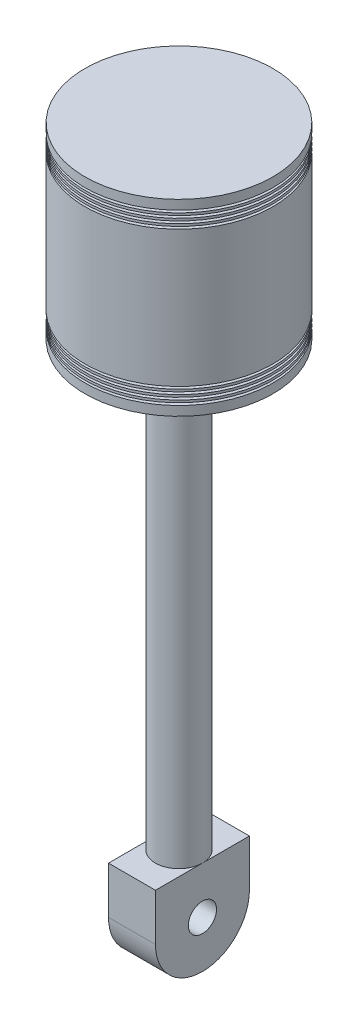
ISO-10303-21;
HEADER;
FILE_DESCRIPTION(('STEP AP214'),'2;1');
FILE_NAME('part.step','',(''),(''),'','','');
FILE_SCHEMA(('AUTOMOTIVE_DESIGN { 1 0 10303 214 1 1 1 1 }'));
ENDSEC;
DATA;
#1=APPLICATION_CONTEXT('core data for automotive mechanical design processes');
#2=APPLICATION_PROTOCOL_DEFINITION('international standard','automotive_design',2000,#1);
#3=PRODUCT_CONTEXT('',#1,'mechanical');
#4=PRODUCT('Part','Part','',(#3));
#5=PRODUCT_RELATED_PRODUCT_CATEGORY('part','',(#4));
#6=PRODUCT_DEFINITION_FORMATION('','',#4);
#7=PRODUCT_DEFINITION_CONTEXT('part definition',#1,'design');
#8=PRODUCT_DEFINITION('design','',#6,#7);
#9=PRODUCT_DEFINITION_SHAPE('','',#8);
#10=(LENGTH_UNIT() NAMED_UNIT(*) SI_UNIT(.MILLI.,.METRE.));
#11=(NAMED_UNIT(*) PLANE_ANGLE_UNIT() SI_UNIT($,.RADIAN.));
#12=(NAMED_UNIT(*) SI_UNIT($,.STERADIAN.) SOLID_ANGLE_UNIT());
#13=UNCERTAINTY_MEASURE_WITH_UNIT(LENGTH_MEASURE(1.E-05),#10,'distance_accuracy_value','');
#14=(GEOMETRIC_REPRESENTATION_CONTEXT(3) GLOBAL_UNCERTAINTY_ASSIGNED_CONTEXT((#13)) GLOBAL_UNIT_ASSIGNED_CONTEXT((#10,
#11,#12)) REPRESENTATION_CONTEXT('',''));
#15=CARTESIAN_POINT('',(0.,0.,0.));
#16=DIRECTION('',(0.,0.,1.));
#17=DIRECTION('',(1.,0.,0.));
#18=AXIS2_PLACEMENT_3D('',#15,#16,#17);
#19=CARTESIAN_POINT('',(-10.12,20.,-10.12));
#20=DIRECTION('',(0.,1.,0.));
#21=DIRECTION('',(0.,0.,1.));
#22=AXIS2_PLACEMENT_3D('',#19,#20,#21);
#23=PLANE('',#22);
#24=CARTESIAN_POINT('',(0.,20.,0.));
#25=DIRECTION('',(0.,-1.,0.));
#26=DIRECTION('',(1.,0.,0.));
#27=AXIS2_PLACEMENT_3D('',#24,#25,#26);
#28=CIRCLE('',#27,10.);
#29=CARTESIAN_POINT('',(10.,20.,0.));
#30=VERTEX_POINT('',#29);
#31=EDGE_CURVE('E21',#30,#30,#28,.F.);
#32=ORIENTED_EDGE('',*,*,#31,.T.);
#33=EDGE_LOOP('',(#32));
#34=FACE_BOUND('',#33,.T.);
#35=ADVANCED_FACE('F17',(#34),#23,.T.);
#36=CARTESIAN_POINT('',(0.,20.,0.));
#37=DIRECTION('',(0.,-1.,0.));
#38=DIRECTION('',(1.,0.,0.));
#39=AXIS2_PLACEMENT_3D('',#36,#37,#38);
#40=CYLINDRICAL_SURFACE('',#39,10.);
#41=ORIENTED_EDGE('',*,*,#31,.F.);
#42=EDGE_LOOP('',(#41));
#43=FACE_BOUND('',#42,.T.);
#44=CARTESIAN_POINT('',(0.,19.,0.));
#45=DIRECTION('',(0.,-1.,0.));
#46=DIRECTION('',(1.,0.,0.));
#47=AXIS2_PLACEMENT_3D('',#44,#45,#46);
#48=CIRCLE('',#47,10.);
#49=CARTESIAN_POINT('',(10.,19.,0.));
#50=VERTEX_POINT('',#49);
#51=EDGE_CURVE('E234',#50,#50,#48,.T.);
#52=ORIENTED_EDGE('',*,*,#51,.F.);
#53=EDGE_LOOP('',(#52));
#54=FACE_BOUND('',#53,.T.);
#55=ADVANCED_FACE('F242',(#43,#54),#40,.T.);
#56=CARTESIAN_POINT('',(-10.12,19.,10.12));
#57=DIRECTION('',(0.,-1.,0.));
#58=DIRECTION('',(0.,0.,-1.));
#59=AXIS2_PLACEMENT_3D('',#56,#57,#58);
#60=PLANE('',#59);
#61=CARTESIAN_POINT('',(0.,19.,0.));
#62=DIRECTION('',(0.,-1.,0.));
#63=DIRECTION('',(0.,0.,-1.));
#64=AXIS2_PLACEMENT_3D('',#61,#62,#63);
#65=CIRCLE('',#64,9.5);
#66=CARTESIAN_POINT('',(0.,19.,-9.5));
#67=VERTEX_POINT('',#66);
#68=EDGE_CURVE('E232',#67,#67,#65,.F.);
#69=ORIENTED_EDGE('',*,*,#68,.T.);
#70=EDGE_LOOP('',(#69));
#71=FACE_BOUND('',#70,.T.);
#72=ORIENTED_EDGE('',*,*,#51,.T.);
#73=EDGE_LOOP('',(#72));
#74=FACE_BOUND('',#73,.T.);
#75=ADVANCED_FACE('F245',(#71,#74),#60,.T.);
#76=CARTESIAN_POINT('',(0.,19.,0.));
#77=DIRECTION('',(0.,-1.,0.));
#78=DIRECTION('',(0.,0.,-1.));
#79=AXIS2_PLACEMENT_3D('',#76,#77,#78);
#80=CYLINDRICAL_SURFACE('',#79,9.5);
#81=ORIENTED_EDGE('',*,*,#68,.F.);
#82=EDGE_LOOP('',(#81));
#83=FACE_BOUND('',#82,.T.);
#84=CARTESIAN_POINT('',(0.,18.75,0.));
#85=DIRECTION('',(0.,-1.,0.));
#86=DIRECTION('',(0.,0.,-1.));
#87=AXIS2_PLACEMENT_3D('',#84,#85,#86);
#88=CIRCLE('',#87,9.5);
#89=CARTESIAN_POINT('',(0.,18.75,-9.5));
#90=VERTEX_POINT('',#89);
#91=EDGE_CURVE('E229',#90,#90,#88,.T.);
#92=ORIENTED_EDGE('',*,*,#91,.F.);
#93=EDGE_LOOP('',(#92));
#94=FACE_BOUND('',#93,.T.);
#95=ADVANCED_FACE('F252',(#83,#94),#80,.T.);
#96=CARTESIAN_POINT('',(-10.12,18.75,-10.12));
#97=DIRECTION('',(0.,1.,0.));
#98=DIRECTION('',(0.,0.,1.));
#99=AXIS2_PLACEMENT_3D('',#96,#97,#98);
#100=PLANE('',#99);
#101=ORIENTED_EDGE('',*,*,#91,.T.);
#102=EDGE_LOOP('',(#101));
#103=FACE_BOUND('',#102,.T.);
#104=CARTESIAN_POINT('',(0.,18.75,0.));
#105=DIRECTION('',(0.,-1.,0.));
#106=DIRECTION('',(0.,0.,-1.));
#107=AXIS2_PLACEMENT_3D('',#104,#105,#106);
#108=CIRCLE('',#107,10.);
#109=CARTESIAN_POINT('',(0.,18.75,-10.));
#110=VERTEX_POINT('',#109);
#111=EDGE_CURVE('E226',#110,#110,#108,.F.);
#112=ORIENTED_EDGE('',*,*,#111,.T.);
#113=EDGE_LOOP('',(#112));
#114=FACE_BOUND('',#113,.T.);
#115=ADVANCED_FACE('F349',(#103,#114),#100,.T.);
#116=CARTESIAN_POINT('',(0.,18.75,0.));
#117=DIRECTION('',(0.,-1.,0.));
#118=DIRECTION('',(0.,0.,-1.));
#119=AXIS2_PLACEMENT_3D('',#116,#117,#118);
#120=CYLINDRICAL_SURFACE('',#119,10.);
#121=ORIENTED_EDGE('',*,*,#111,.F.);
#122=EDGE_LOOP('',(#121));
#123=FACE_BOUND('',#122,.T.);
#124=CARTESIAN_POINT('',(0.,18.5,0.));
#125=DIRECTION('',(0.,-1.,0.));
#126=DIRECTION('',(0.,0.,-1.));
#127=AXIS2_PLACEMENT_3D('',#124,#125,#126);
#128=CIRCLE('',#127,10.);
#129=CARTESIAN_POINT('',(0.,18.5,-10.));
#130=VERTEX_POINT('',#129);
#131=EDGE_CURVE('E223',#130,#130,#128,.T.);
#132=ORIENTED_EDGE('',*,*,#131,.F.);
#133=EDGE_LOOP('',(#132));
#134=FACE_BOUND('',#133,.T.);
#135=ADVANCED_FACE('F347',(#123,#134),#120,.T.);
#136=CARTESIAN_POINT('',(-10.12,18.5,10.12));
#137=DIRECTION('',(0.,-1.,0.));
#138=DIRECTION('',(0.,0.,-1.));
#139=AXIS2_PLACEMENT_3D('',#136,#137,#138);
#140=PLANE('',#139);
#141=CARTESIAN_POINT('',(0.,18.5,0.));
#142=DIRECTION('',(0.,-1.,0.));
#143=DIRECTION('',(1.,0.,0.));
#144=AXIS2_PLACEMENT_3D('',#141,#142,#143);
#145=CIRCLE('',#144,9.5);
#146=CARTESIAN_POINT('',(9.5,18.5,0.));
#147=VERTEX_POINT('',#146);
#148=EDGE_CURVE('E220',#147,#147,#145,.F.);
#149=ORIENTED_EDGE('',*,*,#148,.T.);
#150=EDGE_LOOP('',(#149));
#151=FACE_BOUND('',#150,.T.);
#152=ORIENTED_EDGE('',*,*,#131,.T.);
#153=EDGE_LOOP('',(#152));
#154=FACE_BOUND('',#153,.T.);
#155=ADVANCED_FACE('F345',(#151,#154),#140,.T.);
#156=CARTESIAN_POINT('',(0.,18.5,0.));
#157=DIRECTION('',(0.,-1.,0.));
#158=DIRECTION('',(1.,0.,0.));
#159=AXIS2_PLACEMENT_3D('',#156,#157,#158);
#160=CYLINDRICAL_SURFACE('',#159,9.5);
#161=ORIENTED_EDGE('',*,*,#148,.F.);
#162=EDGE_LOOP('',(#161));
#163=FACE_BOUND('',#162,.T.);
#164=CARTESIAN_POINT('',(0.,18.25,0.));
#165=DIRECTION('',(0.,-1.,0.));
#166=DIRECTION('',(1.,0.,0.));
#167=AXIS2_PLACEMENT_3D('',#164,#165,#166);
#168=CIRCLE('',#167,9.5);
#169=CARTESIAN_POINT('',(9.5,18.25,0.));
#170=VERTEX_POINT('',#169);
#171=EDGE_CURVE('E217',#170,#170,#168,.T.);
#172=ORIENTED_EDGE('',*,*,#171,.F.);
#173=EDGE_LOOP('',(#172));
#174=FACE_BOUND('',#173,.T.);
#175=ADVANCED_FACE('F342',(#163,#174),#160,.T.);
#176=CARTESIAN_POINT('',(-10.12,18.25,-10.12));
#177=DIRECTION('',(0.,1.,0.));
#178=DIRECTION('',(0.,0.,1.));
#179=AXIS2_PLACEMENT_3D('',#176,#177,#178);
#180=PLANE('',#179);
#181=ORIENTED_EDGE('',*,*,#171,.T.);
#182=EDGE_LOOP('',(#181));
#183=FACE_BOUND('',#182,.T.);
#184=CARTESIAN_POINT('',(0.,18.25,0.));
#185=DIRECTION('',(0.,-1.,0.));
#186=DIRECTION('',(0.,0.,-1.));
#187=AXIS2_PLACEMENT_3D('',#184,#185,#186);
#188=CIRCLE('',#187,10.);
#189=CARTESIAN_POINT('',(0.,18.25,-10.));
#190=VERTEX_POINT('',#189);
#191=EDGE_CURVE('E214',#190,#190,#188,.F.);
#192=ORIENTED_EDGE('',*,*,#191,.T.);
#193=EDGE_LOOP('',(#192));
#194=FACE_BOUND('',#193,.T.);
#195=ADVANCED_FACE('F340',(#183,#194),#180,.T.);
#196=CARTESIAN_POINT('',(0.,18.25,0.));
#197=DIRECTION('',(0.,-1.,0.));
#198=DIRECTION('',(0.,0.,-1.));
#199=AXIS2_PLACEMENT_3D('',#196,#197,#198);
#200=CYLINDRICAL_SURFACE('',#199,10.);
#201=ORIENTED_EDGE('',*,*,#191,.F.);
#202=EDGE_LOOP('',(#201));
#203=FACE_BOUND('',#202,.T.);
#204=CARTESIAN_POINT('',(0.,18.,0.));
#205=DIRECTION('',(0.,-1.,0.));
#206=DIRECTION('',(0.,0.,-1.));
#207=AXIS2_PLACEMENT_3D('',#204,#205,#206);
#208=CIRCLE('',#207,10.);
#209=CARTESIAN_POINT('',(0.,18.,-10.));
#210=VERTEX_POINT('',#209);
#211=EDGE_CURVE('E211',#210,#210,#208,.T.);
#212=ORIENTED_EDGE('',*,*,#211,.F.);
#213=EDGE_LOOP('',(#212));
#214=FACE_BOUND('',#213,.T.);
#215=ADVANCED_FACE('F337',(#203,#214),#200,.T.);
#216=CARTESIAN_POINT('',(-10.12,18.,10.12));
#217=DIRECTION('',(0.,-1.,0.));
#218=DIRECTION('',(0.,0.,-1.));
#219=AXIS2_PLACEMENT_3D('',#216,#217,#218);
#220=PLANE('',#219);
#221=CARTESIAN_POINT('',(0.,18.,0.));
#222=DIRECTION('',(0.,-1.,0.));
#223=DIRECTION('',(0.,0.,-1.));
#224=AXIS2_PLACEMENT_3D('',#221,#222,#223);
#225=CIRCLE('',#224,9.5);
#226=CARTESIAN_POINT('',(0.,18.,-9.5));
#227=VERTEX_POINT('',#226);
#228=EDGE_CURVE('E208',#227,#227,#225,.F.);
#229=ORIENTED_EDGE('',*,*,#228,.T.);
#230=EDGE_LOOP('',(#229));
#231=FACE_BOUND('',#230,.T.);
#232=ORIENTED_EDGE('',*,*,#211,.T.);
#233=EDGE_LOOP('',(#232));
#234=FACE_BOUND('',#233,.T.);
#235=ADVANCED_FACE('F335',(#231,#234),#220,.T.);
#236=CARTESIAN_POINT('',(0.,18.,0.));
#237=DIRECTION('',(0.,-1.,0.));
#238=DIRECTION('',(0.,0.,-1.));
#239=AXIS2_PLACEMENT_3D('',#236,#237,#238);
#240=CYLINDRICAL_SURFACE('',#239,9.5);
#241=ORIENTED_EDGE('',*,*,#228,.F.);
#242=EDGE_LOOP('',(#241));
#243=FACE_BOUND('',#242,.T.);
#244=CARTESIAN_POINT('',(0.,17.75,0.));
#245=DIRECTION('',(0.,-1.,0.));
#246=DIRECTION('',(0.,0.,-1.));
#247=AXIS2_PLACEMENT_3D('',#244,#245,#246);
#248=CIRCLE('',#247,9.5);
#249=CARTESIAN_POINT('',(0.,17.75,-9.5));
#250=VERTEX_POINT('',#249);
#251=EDGE_CURVE('E205',#250,#250,#248,.T.);
#252=ORIENTED_EDGE('',*,*,#251,.F.);
#253=EDGE_LOOP('',(#252));
#254=FACE_BOUND('',#253,.T.);
#255=ADVANCED_FACE('F332',(#243,#254),#240,.T.);
#256=CARTESIAN_POINT('',(-10.12,17.75,-10.12));
#257=DIRECTION('',(0.,1.,0.));
#258=DIRECTION('',(0.,0.,1.));
#259=AXIS2_PLACEMENT_3D('',#256,#257,#258);
#260=PLANE('',#259);
#261=ORIENTED_EDGE('',*,*,#251,.T.);
#262=EDGE_LOOP('',(#261));
#263=FACE_BOUND('',#262,.T.);
#264=CARTESIAN_POINT('',(0.,17.75,0.));
#265=DIRECTION('',(0.,-1.,0.));
#266=DIRECTION('',(0.,0.,-1.));
#267=AXIS2_PLACEMENT_3D('',#264,#265,#266);
#268=CIRCLE('',#267,10.);
#269=CARTESIAN_POINT('',(0.,17.75,-10.));
#270=VERTEX_POINT('',#269);
#271=EDGE_CURVE('E202',#270,#270,#268,.F.);
#272=ORIENTED_EDGE('',*,*,#271,.T.);
#273=EDGE_LOOP('',(#272));
#274=FACE_BOUND('',#273,.T.);
#275=ADVANCED_FACE('F330',(#263,#274),#260,.T.);
#276=CARTESIAN_POINT('',(0.,17.75,0.));
#277=DIRECTION('',(0.,-1.,0.));
#278=DIRECTION('',(0.,0.,-1.));
#279=AXIS2_PLACEMENT_3D('',#276,#277,#278);
#280=CYLINDRICAL_SURFACE('',#279,10.);
#281=ORIENTED_EDGE('',*,*,#271,.F.);
#282=EDGE_LOOP('',(#281));
#283=FACE_BOUND('',#282,.T.);
#284=CARTESIAN_POINT('',(0.,17.5,0.));
#285=DIRECTION('',(0.,-1.,0.));
#286=DIRECTION('',(0.,0.,-1.));
#287=AXIS2_PLACEMENT_3D('',#284,#285,#286);
#288=CIRCLE('',#287,10.);
#289=CARTESIAN_POINT('',(0.,17.5,-10.));
#290=VERTEX_POINT('',#289);
#291=EDGE_CURVE('E199',#290,#290,#288,.T.);
#292=ORIENTED_EDGE('',*,*,#291,.F.);
#293=EDGE_LOOP('',(#292));
#294=FACE_BOUND('',#293,.T.);
#295=ADVANCED_FACE('F327',(#283,#294),#280,.T.);
#296=CARTESIAN_POINT('',(-10.12,17.5,10.12));
#297=DIRECTION('',(0.,-1.,0.));
#298=DIRECTION('',(0.,0.,-1.));
#299=AXIS2_PLACEMENT_3D('',#296,#297,#298);
#300=PLANE('',#299);
#301=CARTESIAN_POINT('',(0.,17.5,0.));
#302=DIRECTION('',(0.,-1.,0.));
#303=DIRECTION('',(0.,0.,-1.));
#304=AXIS2_PLACEMENT_3D('',#301,#302,#303);
#305=CIRCLE('',#304,9.5);
#306=CARTESIAN_POINT('',(0.,17.5,-9.5));
#307=VERTEX_POINT('',#306);
#308=EDGE_CURVE('E196',#307,#307,#305,.F.);
#309=ORIENTED_EDGE('',*,*,#308,.T.);
#310=EDGE_LOOP('',(#309));
#311=FACE_BOUND('',#310,.T.);
#312=ORIENTED_EDGE('',*,*,#291,.T.);
#313=EDGE_LOOP('',(#312));
#314=FACE_BOUND('',#313,.T.);
#315=ADVANCED_FACE('F325',(#311,#314),#300,.T.);
#316=CARTESIAN_POINT('',(0.,17.5,0.));
#317=DIRECTION('',(0.,-1.,0.));
#318=DIRECTION('',(0.,0.,-1.));
#319=AXIS2_PLACEMENT_3D('',#316,#317,#318);
#320=CYLINDRICAL_SURFACE('',#319,9.5);
#321=ORIENTED_EDGE('',*,*,#308,.F.);
#322=EDGE_LOOP('',(#321));
#323=FACE_BOUND('',#322,.T.);
#324=CARTESIAN_POINT('',(0.,17.25,0.));
#325=DIRECTION('',(0.,-1.,0.));
#326=DIRECTION('',(0.,0.,-1.));
#327=AXIS2_PLACEMENT_3D('',#324,#325,#326);
#328=CIRCLE('',#327,9.5);
#329=CARTESIAN_POINT('',(0.,17.25,-9.5));
#330=VERTEX_POINT('',#329);
#331=EDGE_CURVE('E193',#330,#330,#328,.T.);
#332=ORIENTED_EDGE('',*,*,#331,.F.);
#333=EDGE_LOOP('',(#332));
#334=FACE_BOUND('',#333,.T.);
#335=ADVANCED_FACE('F322',(#323,#334),#320,.T.);
#336=CARTESIAN_POINT('',(-10.12,17.25,-10.12));
#337=DIRECTION('',(0.,1.,0.));
#338=DIRECTION('',(0.,0.,1.));
#339=AXIS2_PLACEMENT_3D('',#336,#337,#338);
#340=PLANE('',#339);
#341=ORIENTED_EDGE('',*,*,#331,.T.);
#342=EDGE_LOOP('',(#341));
#343=FACE_BOUND('',#342,.T.);
#344=CARTESIAN_POINT('',(0.,17.25,0.));
#345=DIRECTION('',(0.,-1.,0.));
#346=DIRECTION('',(0.,0.,-1.));
#347=AXIS2_PLACEMENT_3D('',#344,#345,#346);
#348=CIRCLE('',#347,10.);
#349=CARTESIAN_POINT('',(0.,17.25,-10.));
#350=VERTEX_POINT('',#349);
#351=EDGE_CURVE('E190',#350,#350,#348,.F.);
#352=ORIENTED_EDGE('',*,*,#351,.T.);
#353=EDGE_LOOP('',(#352));
#354=FACE_BOUND('',#353,.T.);
#355=ADVANCED_FACE('F320',(#343,#354),#340,.T.);
#356=CARTESIAN_POINT('',(0.,17.25,0.));
#357=DIRECTION('',(0.,-1.,0.));
#358=DIRECTION('',(0.,0.,-1.));
#359=AXIS2_PLACEMENT_3D('',#356,#357,#358);
#360=CYLINDRICAL_SURFACE('',#359,10.);
#361=ORIENTED_EDGE('',*,*,#351,.F.);
#362=EDGE_LOOP('',(#361));
#363=FACE_BOUND('',#362,.T.);
#364=CARTESIAN_POINT('',(0.,2.75,0.));
#365=DIRECTION('',(0.,-1.,0.));
#366=DIRECTION('',(0.,0.,-1.));
#367=AXIS2_PLACEMENT_3D('',#364,#365,#366);
#368=CIRCLE('',#367,10.);
#369=CARTESIAN_POINT('',(0.,2.75,-10.));
#370=VERTEX_POINT('',#369);
#371=EDGE_CURVE('E187',#370,#370,#368,.T.);
#372=ORIENTED_EDGE('',*,*,#371,.F.);
#373=EDGE_LOOP('',(#372));
#374=FACE_BOUND('',#373,.T.);
#375=ADVANCED_FACE('F317',(#363,#374),#360,.T.);
#376=CARTESIAN_POINT('',(-10.12,2.75,10.12));
#377=DIRECTION('',(0.,-1.,0.));
#378=DIRECTION('',(0.,0.,-1.));
#379=AXIS2_PLACEMENT_3D('',#376,#377,#378);
#380=PLANE('',#379);
#381=CARTESIAN_POINT('',(0.,2.75,0.));
#382=DIRECTION('',(0.,-1.,0.));
#383=DIRECTION('',(0.,0.,-1.));
#384=AXIS2_PLACEMENT_3D('',#381,#382,#383);
#385=CIRCLE('',#384,9.5);
#386=CARTESIAN_POINT('',(0.,2.75,-9.5));
#387=VERTEX_POINT('',#386);
#388=EDGE_CURVE('E184',#387,#387,#385,.F.);
#389=ORIENTED_EDGE('',*,*,#388,.T.);
#390=EDGE_LOOP('',(#389));
#391=FACE_BOUND('',#390,.T.);
#392=ORIENTED_EDGE('',*,*,#371,.T.);
#393=EDGE_LOOP('',(#392));
#394=FACE_BOUND('',#393,.T.);
#395=ADVANCED_FACE('F315',(#391,#394),#380,.T.);
#396=CARTESIAN_POINT('',(0.,2.75,0.));
#397=DIRECTION('',(0.,-1.,0.));
#398=DIRECTION('',(0.,0.,-1.));
#399=AXIS2_PLACEMENT_3D('',#396,#397,#398);
#400=CYLINDRICAL_SURFACE('',#399,9.5);
#401=ORIENTED_EDGE('',*,*,#388,.F.);
#402=EDGE_LOOP('',(#401));
#403=FACE_BOUND('',#402,.T.);
#404=CARTESIAN_POINT('',(0.,2.5,0.));
#405=DIRECTION('',(0.,-1.,0.));
#406=DIRECTION('',(0.,0.,-1.));
#407=AXIS2_PLACEMENT_3D('',#404,#405,#406);
#408=CIRCLE('',#407,9.5);
#409=CARTESIAN_POINT('',(0.,2.5,-9.5));
#410=VERTEX_POINT('',#409);
#411=EDGE_CURVE('E181',#410,#410,#408,.T.);
#412=ORIENTED_EDGE('',*,*,#411,.F.);
#413=EDGE_LOOP('',(#412));
#414=FACE_BOUND('',#413,.T.);
#415=ADVANCED_FACE('F312',(#403,#414),#400,.T.);
#416=CARTESIAN_POINT('',(-10.12,2.5,-10.12));
#417=DIRECTION('',(0.,1.,0.));
#418=DIRECTION('',(0.,0.,1.));
#419=AXIS2_PLACEMENT_3D('',#416,#417,#418);
#420=PLANE('',#419);
#421=ORIENTED_EDGE('',*,*,#411,.T.);
#422=EDGE_LOOP('',(#421));
#423=FACE_BOUND('',#422,.T.);
#424=CARTESIAN_POINT('',(0.,2.5,0.));
#425=DIRECTION('',(0.,-1.,0.));
#426=DIRECTION('',(1.,0.,0.));
#427=AXIS2_PLACEMENT_3D('',#424,#425,#426);
#428=CIRCLE('',#427,10.);
#429=CARTESIAN_POINT('',(10.,2.5,0.));
#430=VERTEX_POINT('',#429);
#431=EDGE_CURVE('E178',#430,#430,#428,.F.);
#432=ORIENTED_EDGE('',*,*,#431,.T.);
#433=EDGE_LOOP('',(#432));
#434=FACE_BOUND('',#433,.T.);
#435=ADVANCED_FACE('F310',(#423,#434),#420,.T.);
#436=CARTESIAN_POINT('',(0.,2.5,0.));
#437=DIRECTION('',(0.,-1.,0.));
#438=DIRECTION('',(1.,0.,0.));
#439=AXIS2_PLACEMENT_3D('',#436,#437,#438);
#440=CYLINDRICAL_SURFACE('',#439,10.);
#441=ORIENTED_EDGE('',*,*,#431,.F.);
#442=EDGE_LOOP('',(#441));
#443=FACE_BOUND('',#442,.T.);
#444=CARTESIAN_POINT('',(0.,2.25,0.));
#445=DIRECTION('',(0.,-1.,0.));
#446=DIRECTION('',(1.,0.,0.));
#447=AXIS2_PLACEMENT_3D('',#444,#445,#446);
#448=CIRCLE('',#447,10.);
#449=CARTESIAN_POINT('',(10.,2.25,0.));
#450=VERTEX_POINT('',#449);
#451=EDGE_CURVE('E175',#450,#450,#448,.T.);
#452=ORIENTED_EDGE('',*,*,#451,.F.);
#453=EDGE_LOOP('',(#452));
#454=FACE_BOUND('',#453,.T.);
#455=ADVANCED_FACE('F307',(#443,#454),#440,.T.);
#456=CARTESIAN_POINT('',(-10.12,2.25,10.12));
#457=DIRECTION('',(0.,-1.,0.));
#458=DIRECTION('',(0.,0.,-1.));
#459=AXIS2_PLACEMENT_3D('',#456,#457,#458);
#460=PLANE('',#459);
#461=CARTESIAN_POINT('',(0.,2.25,0.));
#462=DIRECTION('',(0.,-1.,0.));
#463=DIRECTION('',(0.,0.,-1.));
#464=AXIS2_PLACEMENT_3D('',#461,#462,#463);
#465=CIRCLE('',#464,9.5);
#466=CARTESIAN_POINT('',(0.,2.25,-9.5));
#467=VERTEX_POINT('',#466);
#468=EDGE_CURVE('E172',#467,#467,#465,.F.);
#469=ORIENTED_EDGE('',*,*,#468,.T.);
#470=EDGE_LOOP('',(#469));
#471=FACE_BOUND('',#470,.T.);
#472=ORIENTED_EDGE('',*,*,#451,.T.);
#473=EDGE_LOOP('',(#472));
#474=FACE_BOUND('',#473,.T.);
#475=ADVANCED_FACE('F305',(#471,#474),#460,.T.);
#476=CARTESIAN_POINT('',(0.,2.25,0.));
#477=DIRECTION('',(0.,-1.,0.));
#478=DIRECTION('',(0.,0.,-1.));
#479=AXIS2_PLACEMENT_3D('',#476,#477,#478);
#480=CYLINDRICAL_SURFACE('',#479,9.5);
#481=ORIENTED_EDGE('',*,*,#468,.F.);
#482=EDGE_LOOP('',(#481));
#483=FACE_BOUND('',#482,.T.);
#484=CARTESIAN_POINT('',(0.,2.,0.));
#485=DIRECTION('',(0.,-1.,0.));
#486=DIRECTION('',(0.,0.,-1.));
#487=AXIS2_PLACEMENT_3D('',#484,#485,#486);
#488=CIRCLE('',#487,9.5);
#489=CARTESIAN_POINT('',(0.,2.,-9.5));
#490=VERTEX_POINT('',#489);
#491=EDGE_CURVE('E169',#490,#490,#488,.T.);
#492=ORIENTED_EDGE('',*,*,#491,.F.);
#493=EDGE_LOOP('',(#492));
#494=FACE_BOUND('',#493,.T.);
#495=ADVANCED_FACE('F302',(#483,#494),#480,.T.);
#496=CARTESIAN_POINT('',(-10.12,2.,-10.12));
#497=DIRECTION('',(0.,1.,0.));
#498=DIRECTION('',(0.,0.,1.));
#499=AXIS2_PLACEMENT_3D('',#496,#497,#498);
#500=PLANE('',#499);
#501=ORIENTED_EDGE('',*,*,#491,.T.);
#502=EDGE_LOOP('',(#501));
#503=FACE_BOUND('',#502,.T.);
#504=CARTESIAN_POINT('',(0.,2.,0.));
#505=DIRECTION('',(0.,-1.,0.));
#506=DIRECTION('',(0.,0.,-1.));
#507=AXIS2_PLACEMENT_3D('',#504,#505,#506);
#508=CIRCLE('',#507,10.);
#509=CARTESIAN_POINT('',(0.,2.,-10.));
#510=VERTEX_POINT('',#509);
#511=EDGE_CURVE('E166',#510,#510,#508,.F.);
#512=ORIENTED_EDGE('',*,*,#511,.T.);
#513=EDGE_LOOP('',(#512));
#514=FACE_BOUND('',#513,.T.);
#515=ADVANCED_FACE('F300',(#503,#514),#500,.T.);
#516=CARTESIAN_POINT('',(0.,2.,0.));
#517=DIRECTION('',(0.,-1.,0.));
#518=DIRECTION('',(0.,0.,-1.));
#519=AXIS2_PLACEMENT_3D('',#516,#517,#518);
#520=CYLINDRICAL_SURFACE('',#519,10.);
#521=ORIENTED_EDGE('',*,*,#511,.F.);
#522=EDGE_LOOP('',(#521));
#523=FACE_BOUND('',#522,.T.);
#524=CARTESIAN_POINT('',(0.,1.75,0.));
#525=DIRECTION('',(0.,-1.,0.));
#526=DIRECTION('',(0.,0.,-1.));
#527=AXIS2_PLACEMENT_3D('',#524,#525,#526);
#528=CIRCLE('',#527,10.);
#529=CARTESIAN_POINT('',(0.,1.75,-10.));
#530=VERTEX_POINT('',#529);
#531=EDGE_CURVE('E163',#530,#530,#528,.T.);
#532=ORIENTED_EDGE('',*,*,#531,.F.);
#533=EDGE_LOOP('',(#532));
#534=FACE_BOUND('',#533,.T.);
#535=ADVANCED_FACE('F297',(#523,#534),#520,.T.);
#536=CARTESIAN_POINT('',(-10.12,1.75,10.12));
#537=DIRECTION('',(0.,-1.,0.));
#538=DIRECTION('',(0.,0.,-1.));
#539=AXIS2_PLACEMENT_3D('',#536,#537,#538);
#540=PLANE('',#539);
#541=CARTESIAN_POINT('',(0.,1.75,0.));
#542=DIRECTION('',(0.,-1.,0.));
#543=DIRECTION('',(0.,0.,-1.));
#544=AXIS2_PLACEMENT_3D('',#541,#542,#543);
#545=CIRCLE('',#544,9.5);
#546=CARTESIAN_POINT('',(0.,1.75,-9.5));
#547=VERTEX_POINT('',#546);
#548=EDGE_CURVE('E160',#547,#547,#545,.F.);
#549=ORIENTED_EDGE('',*,*,#548,.T.);
#550=EDGE_LOOP('',(#549));
#551=FACE_BOUND('',#550,.T.);
#552=ORIENTED_EDGE('',*,*,#531,.T.);
#553=EDGE_LOOP('',(#552));
#554=FACE_BOUND('',#553,.T.);
#555=ADVANCED_FACE('F295',(#551,#554),#540,.T.);
#556=CARTESIAN_POINT('',(0.,1.75,0.));
#557=DIRECTION('',(0.,-1.,0.));
#558=DIRECTION('',(0.,0.,-1.));
#559=AXIS2_PLACEMENT_3D('',#556,#557,#558);
#560=CYLINDRICAL_SURFACE('',#559,9.5);
#561=ORIENTED_EDGE('',*,*,#548,.F.);
#562=EDGE_LOOP('',(#561));
#563=FACE_BOUND('',#562,.T.);
#564=CARTESIAN_POINT('',(0.,1.5,0.));
#565=DIRECTION('',(0.,-1.,0.));
#566=DIRECTION('',(0.,0.,-1.));
#567=AXIS2_PLACEMENT_3D('',#564,#565,#566);
#568=CIRCLE('',#567,9.5);
#569=CARTESIAN_POINT('',(0.,1.5,-9.5));
#570=VERTEX_POINT('',#569);
#571=EDGE_CURVE('E157',#570,#570,#568,.T.);
#572=ORIENTED_EDGE('',*,*,#571,.F.);
#573=EDGE_LOOP('',(#572));
#574=FACE_BOUND('',#573,.T.);
#575=ADVANCED_FACE('F292',(#563,#574),#560,.T.);
#576=CARTESIAN_POINT('',(-10.12,1.5,-10.12));
#577=DIRECTION('',(0.,1.,0.));
#578=DIRECTION('',(0.,0.,1.));
#579=AXIS2_PLACEMENT_3D('',#576,#577,#578);
#580=PLANE('',#579);
#581=ORIENTED_EDGE('',*,*,#571,.T.);
#582=EDGE_LOOP('',(#581));
#583=FACE_BOUND('',#582,.T.);
#584=CARTESIAN_POINT('',(0.,1.5,0.));
#585=DIRECTION('',(0.,-1.,0.));
#586=DIRECTION('',(0.,0.,-1.));
#587=AXIS2_PLACEMENT_3D('',#584,#585,#586);
#588=CIRCLE('',#587,10.);
#589=CARTESIAN_POINT('',(0.,1.5,-10.));
#590=VERTEX_POINT('',#589);
#591=EDGE_CURVE('E154',#590,#590,#588,.F.);
#592=ORIENTED_EDGE('',*,*,#591,.T.);
#593=EDGE_LOOP('',(#592));
#594=FACE_BOUND('',#593,.T.);
#595=ADVANCED_FACE('F290',(#583,#594),#580,.T.);
#596=CARTESIAN_POINT('',(0.,1.5,0.));
#597=DIRECTION('',(0.,-1.,0.));
#598=DIRECTION('',(0.,0.,-1.));
#599=AXIS2_PLACEMENT_3D('',#596,#597,#598);
#600=CYLINDRICAL_SURFACE('',#599,10.);
#601=ORIENTED_EDGE('',*,*,#591,.F.);
#602=EDGE_LOOP('',(#601));
#603=FACE_BOUND('',#602,.T.);
#604=CARTESIAN_POINT('',(0.,1.25,0.));
#605=DIRECTION('',(0.,-1.,0.));
#606=DIRECTION('',(0.,0.,-1.));
#607=AXIS2_PLACEMENT_3D('',#604,#605,#606);
#608=CIRCLE('',#607,10.);
#609=CARTESIAN_POINT('',(0.,1.25,-10.));
#610=VERTEX_POINT('',#609);
#611=EDGE_CURVE('E151',#610,#610,#608,.T.);
#612=ORIENTED_EDGE('',*,*,#611,.F.);
#613=EDGE_LOOP('',(#612));
#614=FACE_BOUND('',#613,.T.);
#615=ADVANCED_FACE('F287',(#603,#614),#600,.T.);
#616=CARTESIAN_POINT('',(-10.12,1.25,10.12));
#617=DIRECTION('',(0.,-1.,0.));
#618=DIRECTION('',(0.,0.,-1.));
#619=AXIS2_PLACEMENT_3D('',#616,#617,#618);
#620=PLANE('',#619);
#621=CARTESIAN_POINT('',(0.,1.25,0.));
#622=DIRECTION('',(0.,-1.,0.));
#623=DIRECTION('',(1.,0.,0.));
#624=AXIS2_PLACEMENT_3D('',#621,#622,#623);
#625=CIRCLE('',#624,9.5);
#626=CARTESIAN_POINT('',(9.5,1.25,0.));
#627=VERTEX_POINT('',#626);
#628=EDGE_CURVE('E148',#627,#627,#625,.F.);
#629=ORIENTED_EDGE('',*,*,#628,.T.);
#630=EDGE_LOOP('',(#629));
#631=FACE_BOUND('',#630,.T.);
#632=ORIENTED_EDGE('',*,*,#611,.T.);
#633=EDGE_LOOP('',(#632));
#634=FACE_BOUND('',#633,.T.);
#635=ADVANCED_FACE('F285',(#631,#634),#620,.T.);
#636=CARTESIAN_POINT('',(0.,1.25,0.));
#637=DIRECTION('',(0.,-1.,0.));
#638=DIRECTION('',(1.,0.,0.));
#639=AXIS2_PLACEMENT_3D('',#636,#637,#638);
#640=CYLINDRICAL_SURFACE('',#639,9.5);
#641=ORIENTED_EDGE('',*,*,#628,.F.);
#642=EDGE_LOOP('',(#641));
#643=FACE_BOUND('',#642,.T.);
#644=CARTESIAN_POINT('',(0.,1.,0.));
#645=DIRECTION('',(0.,-1.,0.));
#646=DIRECTION('',(1.,0.,0.));
#647=AXIS2_PLACEMENT_3D('',#644,#645,#646);
#648=CIRCLE('',#647,9.5);
#649=CARTESIAN_POINT('',(9.5,1.,0.));
#650=VERTEX_POINT('',#649);
#651=EDGE_CURVE('E145',#650,#650,#648,.T.);
#652=ORIENTED_EDGE('',*,*,#651,.F.);
#653=EDGE_LOOP('',(#652));
#654=FACE_BOUND('',#653,.T.);
#655=ADVANCED_FACE('F282',(#643,#654),#640,.T.);
#656=CARTESIAN_POINT('',(-10.12,1.,-10.12));
#657=DIRECTION('',(0.,1.,0.));
#658=DIRECTION('',(0.,0.,1.));
#659=AXIS2_PLACEMENT_3D('',#656,#657,#658);
#660=PLANE('',#659);
#661=ORIENTED_EDGE('',*,*,#651,.T.);
#662=EDGE_LOOP('',(#661));
#663=FACE_BOUND('',#662,.T.);
#664=CARTESIAN_POINT('',(0.,1.,0.));
#665=DIRECTION('',(0.,-1.,0.));
#666=DIRECTION('',(0.,0.,-1.));
#667=AXIS2_PLACEMENT_3D('',#664,#665,#666);
#668=CIRCLE('',#667,10.);
#669=CARTESIAN_POINT('',(0.,1.,-10.));
#670=VERTEX_POINT('',#669);
#671=EDGE_CURVE('E142',#670,#670,#668,.F.);
#672=ORIENTED_EDGE('',*,*,#671,.T.);
#673=EDGE_LOOP('',(#672));
#674=FACE_BOUND('',#673,.T.);
#675=ADVANCED_FACE('F280',(#663,#674),#660,.T.);
#676=CARTESIAN_POINT('',(0.,1.,0.));
#677=DIRECTION('',(0.,-1.,0.));
#678=DIRECTION('',(0.,0.,-1.));
#679=AXIS2_PLACEMENT_3D('',#676,#677,#678);
#680=CYLINDRICAL_SURFACE('',#679,10.);
#681=ORIENTED_EDGE('',*,*,#671,.F.);
#682=EDGE_LOOP('',(#681));
#683=FACE_BOUND('',#682,.T.);
#684=CARTESIAN_POINT('',(0.,0.,0.));
#685=DIRECTION('',(0.,-1.,0.));
#686=DIRECTION('',(0.,0.,-1.));
#687=AXIS2_PLACEMENT_3D('',#684,#685,#686);
#688=CIRCLE('',#687,10.);
#689=CARTESIAN_POINT('',(0.,0.,-10.));
#690=VERTEX_POINT('',#689);
#691=EDGE_CURVE('E139',#690,#690,#688,.T.);
#692=ORIENTED_EDGE('',*,*,#691,.F.);
#693=EDGE_LOOP('',(#692));
#694=FACE_BOUND('',#693,.T.);
#695=ADVANCED_FACE('F277',(#683,#694),#680,.T.);
#696=CARTESIAN_POINT('',(-10.12,0.,10.12));
#697=DIRECTION('',(0.,-1.,0.));
#698=DIRECTION('',(0.,0.,-1.));
#699=AXIS2_PLACEMENT_3D('',#696,#697,#698);
#700=PLANE('',#699);
#701=CARTESIAN_POINT('',(0.,0.,0.));
#702=DIRECTION('',(0.,1.,0.));
#703=DIRECTION('',(0.,0.,1.));
#704=AXIS2_PLACEMENT_3D('',#701,#702,#703);
#705=CIRCLE('',#704,2.5);
#706=CARTESIAN_POINT('',(0.,0.,2.5));
#707=VERTEX_POINT('',#706);
#708=EDGE_CURVE('E79',#707,#707,#705,.T.);
#709=ORIENTED_EDGE('',*,*,#708,.T.);
#710=EDGE_LOOP('',(#709));
#711=FACE_BOUND('',#710,.T.);
#712=ORIENTED_EDGE('',*,*,#691,.T.);
#713=EDGE_LOOP('',(#712));
#714=FACE_BOUND('',#713,.T.);
#715=ADVANCED_FACE('F275',(#711,#714),#700,.T.);
#716=CARTESIAN_POINT('',(0.,-47.,0.));
#717=DIRECTION('',(0.,1.,0.));
#718=DIRECTION('',(0.,0.,1.));
#719=AXIS2_PLACEMENT_3D('',#716,#717,#718);
#720=CYLINDRICAL_SURFACE('',#719,2.5);
#721=CARTESIAN_POINT('',(0.,-47.,0.));
#722=DIRECTION('',(0.,1.,0.));
#723=DIRECTION('',(0.,0.,1.));
#724=AXIS2_PLACEMENT_3D('',#721,#722,#723);
#725=CIRCLE('',#724,2.5);
#726=CARTESIAN_POINT('',(2.5,-47.,-2.56379008088408E-10));
#727=VERTEX_POINT('',#726);
#728=CARTESIAN_POINT('',(-2.5,-47.,-4.80862246492972E-10));
#729=VERTEX_POINT('',#728);
#730=EDGE_CURVE('E59',#727,#729,#725,.T.);
#731=ORIENTED_EDGE('',*,*,#730,.T.);
#732=CARTESIAN_POINT('',(0.,-47.,0.));
#733=DIRECTION('',(0.,1.,0.));
#734=DIRECTION('',(0.,0.,1.));
#735=AXIS2_PLACEMENT_3D('',#732,#733,#734);
#736=CIRCLE('',#735,2.5);
#737=EDGE_CURVE('E78',#729,#727,#736,.T.);
#738=ORIENTED_EDGE('',*,*,#737,.T.);
#739=EDGE_LOOP('',(#731,#738));
#740=FACE_BOUND('',#739,.T.);
#741=ORIENTED_EDGE('',*,*,#708,.F.);
#742=EDGE_LOOP('',(#741));
#743=FACE_BOUND('',#742,.T.);
#744=ADVANCED_FACE('F272',(#740,#743),#720,.T.);
#745=CARTESIAN_POINT('',(-2.5,-52.,5.));
#746=DIRECTION('',(0.,0.,-1.));
#747=DIRECTION('',(0.,1.,0.));
#748=AXIS2_PLACEMENT_3D('',#745,#746,#747);
#749=PLANE('',#748);
#750=DIRECTION('',(-1.,0.,0.));
#751=VECTOR('',#750,1.);
#752=CARTESIAN_POINT('',(0.,-52.0000000008979,5.));
#753=LINE('',#752,#751);
#754=CARTESIAN_POINT('',(-2.5,-52.000000000449,5.));
#755=VERTEX_POINT('',#754);
#756=CARTESIAN_POINT('',(2.5,-52.000000000449,5.));
#757=VERTEX_POINT('',#756);
#758=EDGE_CURVE('E93',#755,#757,#753,.F.);
#759=ORIENTED_EDGE('',*,*,#758,.T.);
#760=DIRECTION('',(0.,1.,0.));
#761=VECTOR('',#760,1.);
#762=CARTESIAN_POINT('',(2.5,-52.03,5.));
#763=LINE('',#762,#761);
#764=CARTESIAN_POINT('',(2.5,-47.,5.));
#765=VERTEX_POINT('',#764);
#766=EDGE_CURVE('E86',#757,#765,#763,.T.);
#767=ORIENTED_EDGE('',*,*,#766,.T.);
#768=DIRECTION('',(-1.,0.,0.));
#769=VECTOR('',#768,1.);
#770=CARTESIAN_POINT('',(0.,-47.,5.));
#771=LINE('',#770,#769);
#772=CARTESIAN_POINT('',(-2.5,-47.,5.));
#773=VERTEX_POINT('',#772);
#774=EDGE_CURVE('E68',#765,#773,#771,.T.);
#775=ORIENTED_EDGE('',*,*,#774,.T.);
#776=DIRECTION('',(0.,1.,0.));
#777=VECTOR('',#776,1.);
#778=CARTESIAN_POINT('',(-2.5,-52.03,5.));
#779=LINE('',#778,#777);
#780=EDGE_CURVE('E94',#755,#773,#779,.T.);
#781=ORIENTED_EDGE('',*,*,#780,.F.);
#782=EDGE_LOOP('',(#759,#767,#775,#781));
#783=FACE_BOUND('',#782,.T.);
#784=ADVANCED_FACE('F92',(#783),#749,.F.);
#785=CARTESIAN_POINT('',(-2.5,-47.,5.));
#786=DIRECTION('',(0.,-1.,0.));
#787=DIRECTION('',(0.,0.,-1.));
#788=AXIS2_PLACEMENT_3D('',#785,#786,#787);
#789=PLANE('',#788);
#790=ORIENTED_EDGE('',*,*,#737,.F.);
#791=DIRECTION('',(0.,0.,-1.));
#792=VECTOR('',#791,1.);
#793=CARTESIAN_POINT('',(-2.5,-47.,0.));
#794=LINE('',#793,#792);
#795=EDGE_CURVE('E74',#773,#729,#794,.T.);
#796=ORIENTED_EDGE('',*,*,#795,.F.);
#797=ORIENTED_EDGE('',*,*,#774,.F.);
#798=DIRECTION('',(0.,0.,-1.));
#799=VECTOR('',#798,1.);
#800=CARTESIAN_POINT('',(2.5,-47.,0.));
#801=LINE('',#800,#799);
#802=EDGE_CURVE('E72',#765,#727,#801,.T.);
#803=ORIENTED_EDGE('',*,*,#802,.T.);
#804=EDGE_LOOP('',(#790,#796,#797,#803));
#805=FACE_BOUND('',#804,.T.);
#806=ADVANCED_FACE('F71',(#805),#789,.F.);
#807=CARTESIAN_POINT('',(-2.5,-47.,0.03));
#808=DIRECTION('',(0.,-1.,0.));
#809=DIRECTION('',(0.,0.,-1.));
#810=AXIS2_PLACEMENT_3D('',#807,#808,#809);
#811=PLANE('',#810);
#812=ORIENTED_EDGE('',*,*,#730,.F.);
#813=DIRECTION('',(0.,0.,-1.));
#814=VECTOR('',#813,1.);
#815=CARTESIAN_POINT('',(2.5,-47.,0.));
#816=LINE('',#815,#814);
#817=CARTESIAN_POINT('',(2.5,-47.,-5.));
#818=VERTEX_POINT('',#817);
#819=EDGE_CURVE('E89',#727,#818,#816,.T.);
#820=ORIENTED_EDGE('',*,*,#819,.T.);
#821=DIRECTION('',(-1.,0.,0.));
#822=VECTOR('',#821,1.);
#823=CARTESIAN_POINT('',(0.,-47.,-5.));
#824=LINE('',#823,#822);
#825=CARTESIAN_POINT('',(-2.5,-47.,-5.));
#826=VERTEX_POINT('',#825);
#827=EDGE_CURVE('E112',#818,#826,#824,.T.);
#828=ORIENTED_EDGE('',*,*,#827,.T.);
#829=DIRECTION('',(0.,0.,-1.));
#830=VECTOR('',#829,1.);
#831=CARTESIAN_POINT('',(-2.5,-47.,0.));
#832=LINE('',#831,#830);
#833=EDGE_CURVE('E117',#729,#826,#832,.T.);
#834=ORIENTED_EDGE('',*,*,#833,.F.);
#835=EDGE_LOOP('',(#812,#820,#828,#834));
#836=FACE_BOUND('',#835,.T.);
#837=ADVANCED_FACE('F418',(#836),#811,.F.);
#838=CARTESIAN_POINT('',(-2.5,-47.,-5.));
#839=DIRECTION('',(0.,0.,1.));
#840=DIRECTION('',(0.,-1.,0.));
#841=AXIS2_PLACEMENT_3D('',#838,#839,#840);
#842=PLANE('',#841);
#843=ORIENTED_EDGE('',*,*,#827,.F.);
#844=DIRECTION('',(0.,-1.,0.));
#845=VECTOR('',#844,1.);
#846=CARTESIAN_POINT('',(2.5,-52.03,-5.));
#847=LINE('',#846,#845);
#848=CARTESIAN_POINT('',(2.5,-52.0000000010255,-5.));
#849=VERTEX_POINT('',#848);
#850=EDGE_CURVE('E99',#818,#849,#847,.T.);
#851=ORIENTED_EDGE('',*,*,#850,.T.);
#852=DIRECTION('',(1.,0.,0.));
#853=VECTOR('',#852,1.);
#854=CARTESIAN_POINT('',(0.,-52.000000002051,-5.));
#855=LINE('',#854,#853);
#856=CARTESIAN_POINT('',(-2.5,-52.0000000010255,-5.));
#857=VERTEX_POINT('',#856);
#858=EDGE_CURVE('E90',#849,#857,#855,.F.);
#859=ORIENTED_EDGE('',*,*,#858,.T.);
#860=DIRECTION('',(0.,-1.,0.));
#861=VECTOR('',#860,1.);
#862=CARTESIAN_POINT('',(-2.5,-52.03,-5.));
#863=LINE('',#862,#861);
#864=EDGE_CURVE('E36',#826,#857,#863,.T.);
#865=ORIENTED_EDGE('',*,*,#864,.F.);
#866=EDGE_LOOP('',(#843,#851,#859,#865));
#867=FACE_BOUND('',#866,.T.);
#868=ADVANCED_FACE('F270',(#867),#842,.F.);
#869=CARTESIAN_POINT('',(2.5,-52.,0.));
#870=DIRECTION('',(-1.,0.,0.));
#871=DIRECTION('',(0.,-1.,0.));
#872=AXIS2_PLACEMENT_3D('',#869,#870,#871);
#873=CYLINDRICAL_SURFACE('',#872,5.);
#874=ORIENTED_EDGE('',*,*,#858,.F.);
#875=CARTESIAN_POINT('',(2.5,-52.,0.));
#876=DIRECTION('',(-1.,0.,0.));
#877=DIRECTION('',(0.,-1.,0.));
#878=AXIS2_PLACEMENT_3D('',#875,#876,#877);
#879=CIRCLE('',#878,5.);
#880=EDGE_CURVE('E95',#849,#757,#879,.T.);
#881=ORIENTED_EDGE('',*,*,#880,.T.);
#882=ORIENTED_EDGE('',*,*,#758,.F.);
#883=CARTESIAN_POINT('',(-2.5,-52.,0.));
#884=DIRECTION('',(-1.,0.,0.));
#885=DIRECTION('',(0.,-1.,0.));
#886=AXIS2_PLACEMENT_3D('',#883,#884,#885);
#887=CIRCLE('',#886,5.);
#888=EDGE_CURVE('E133',#857,#755,#887,.T.);
#889=ORIENTED_EDGE('',*,*,#888,.F.);
#890=EDGE_LOOP('',(#874,#881,#882,#889));
#891=FACE_BOUND('',#890,.T.);
#892=ADVANCED_FACE('F267',(#891),#873,.T.);
#893=CARTESIAN_POINT('',(2.5,-57.06,-5.));
#894=DIRECTION('',(-1.,0.,0.));
#895=DIRECTION('',(0.,0.,1.));
#896=AXIS2_PLACEMENT_3D('',#893,#894,#895);
#897=PLANE('',#896);
#898=CARTESIAN_POINT('',(2.5,-52.,0.));
#899=DIRECTION('',(-1.,0.,0.));
#900=DIRECTION('',(0.,-1.,0.));
#901=AXIS2_PLACEMENT_3D('',#898,#899,#900);
#902=CIRCLE('',#901,1.5);
#903=CARTESIAN_POINT('',(2.5,-53.5,0.));
#904=VERTEX_POINT('',#903);
#905=EDGE_CURVE('E27',#904,#904,#902,.F.);
#906=ORIENTED_EDGE('',*,*,#905,.F.);
#907=EDGE_LOOP('',(#906));
#908=FACE_BOUND('',#907,.T.);
#909=ORIENTED_EDGE('',*,*,#880,.F.);
#910=ORIENTED_EDGE('',*,*,#850,.F.);
#911=ORIENTED_EDGE('',*,*,#819,.F.);
#912=ORIENTED_EDGE('',*,*,#802,.F.);
#913=ORIENTED_EDGE('',*,*,#766,.F.);
#914=EDGE_LOOP('',(#909,#910,#911,#912,#913));
#915=FACE_BOUND('',#914,.T.);
#916=ADVANCED_FACE('F85',(#908,#915),#897,.F.);
#917=CARTESIAN_POINT('',(-2.5,-57.06,-5.));
#918=DIRECTION('',(-1.,0.,0.));
#919=DIRECTION('',(0.,0.,1.));
#920=AXIS2_PLACEMENT_3D('',#917,#918,#919);
#921=PLANE('',#920);
#922=CARTESIAN_POINT('',(-2.5,-52.,0.));
#923=DIRECTION('',(-1.,0.,0.));
#924=DIRECTION('',(0.,-1.,0.));
#925=AXIS2_PLACEMENT_3D('',#922,#923,#924);
#926=CIRCLE('',#925,1.5);
#927=CARTESIAN_POINT('',(-2.5,-53.5,0.));
#928=VERTEX_POINT('',#927);
#929=EDGE_CURVE('E11',#928,#928,#926,.T.);
#930=ORIENTED_EDGE('',*,*,#929,.F.);
#931=EDGE_LOOP('',(#930));
#932=FACE_BOUND('',#931,.T.);
#933=ORIENTED_EDGE('',*,*,#864,.T.);
#934=ORIENTED_EDGE('',*,*,#888,.T.);
#935=ORIENTED_EDGE('',*,*,#780,.T.);
#936=ORIENTED_EDGE('',*,*,#795,.T.);
#937=ORIENTED_EDGE('',*,*,#833,.T.);
#938=EDGE_LOOP('',(#933,#934,#935,#936,#937));
#939=FACE_BOUND('',#938,.T.);
#940=ADVANCED_FACE('F19',(#932,#939),#921,.T.);
#941=CARTESIAN_POINT('',(2.5,-52.,0.));
#942=DIRECTION('',(-1.,0.,0.));
#943=DIRECTION('',(0.,-1.,0.));
#944=AXIS2_PLACEMENT_3D('',#941,#942,#943);
#945=CYLINDRICAL_SURFACE('',#944,1.5);
#946=ORIENTED_EDGE('',*,*,#929,.T.);
#947=EDGE_LOOP('',(#946));
#948=FACE_BOUND('',#947,.T.);
#949=ORIENTED_EDGE('',*,*,#905,.T.);
#950=EDGE_LOOP('',(#949));
#951=FACE_BOUND('',#950,.T.);
#952=ADVANCED_FACE('F257',(#948,#951),#945,.F.);
#953=CLOSED_SHELL('',(#35,#55,#75,#95,#115,#135,#155,#175,#195,#215,#235,#255,#275,#295,#315,
#335,#355,#375,#395,#415,#435,#455,#475,#495,#515,#535,#555,#575,#595,#615,#635,#655,#675,#695,
#715,#744,#784,#806,#837,#868,#892,#916,#940,#952));
#954=MANIFOLD_SOLID_BREP('B1',#953);
#955=ADVANCED_BREP_SHAPE_REPRESENTATION('',(#18,#954),#14);
#956=SHAPE_DEFINITION_REPRESENTATION(#9,#955);
ENDSEC;
END-ISO-10303-21;
